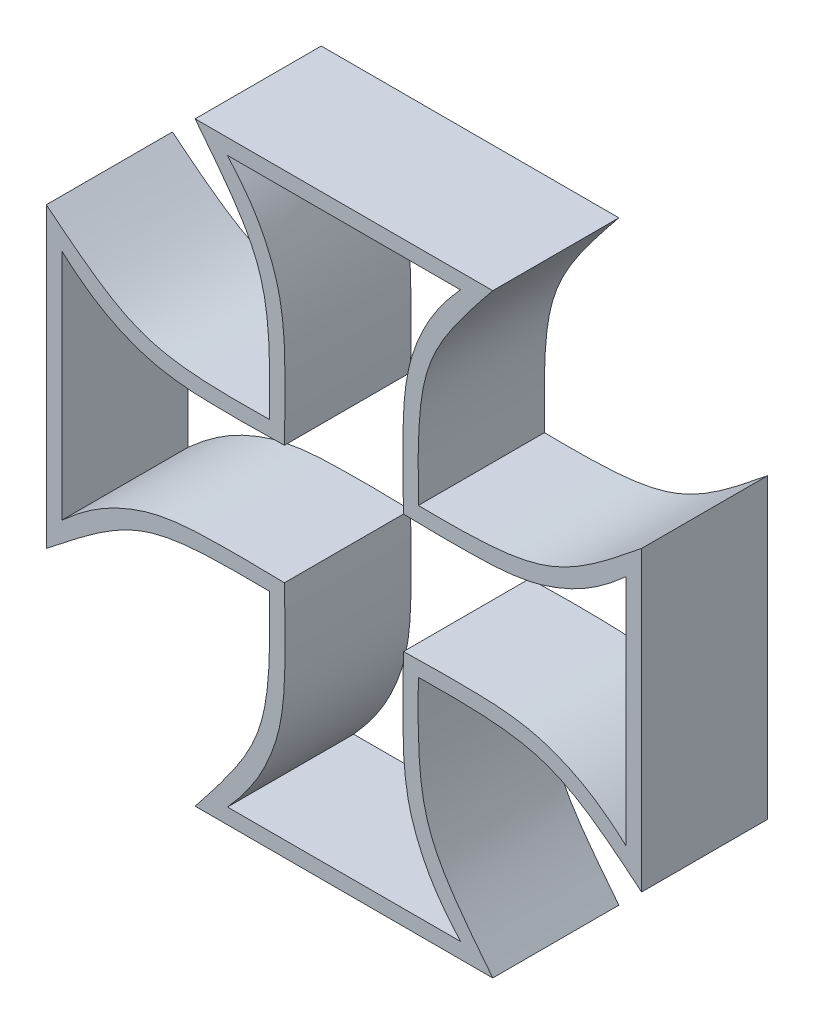
ISO-10303-21;
HEADER;
FILE_DESCRIPTION(('STEP AP214'),'2;1');
FILE_NAME('part.step','',(''),(''),'','','');
FILE_SCHEMA(('AUTOMOTIVE_DESIGN { 1 0 10303 214 1 1 1 1 }'));
ENDSEC;
DATA;
#1=APPLICATION_CONTEXT('core data for automotive mechanical design processes');
#2=APPLICATION_PROTOCOL_DEFINITION('international standard','automotive_design',2000,#1);
#3=PRODUCT_CONTEXT('',#1,'mechanical');
#4=PRODUCT('Part','Part','',(#3));
#5=PRODUCT_RELATED_PRODUCT_CATEGORY('part','',(#4));
#6=PRODUCT_DEFINITION_FORMATION('','',#4);
#7=PRODUCT_DEFINITION_CONTEXT('part definition',#1,'design');
#8=PRODUCT_DEFINITION('design','',#6,#7);
#9=PRODUCT_DEFINITION_SHAPE('','',#8);
#10=(LENGTH_UNIT() NAMED_UNIT(*) SI_UNIT(.MILLI.,.METRE.));
#11=(NAMED_UNIT(*) PLANE_ANGLE_UNIT() SI_UNIT($,.RADIAN.));
#12=(NAMED_UNIT(*) SI_UNIT($,.STERADIAN.) SOLID_ANGLE_UNIT());
#13=UNCERTAINTY_MEASURE_WITH_UNIT(LENGTH_MEASURE(1.E-05),#10,'distance_accuracy_value','');
#14=(GEOMETRIC_REPRESENTATION_CONTEXT(3) GLOBAL_UNCERTAINTY_ASSIGNED_CONTEXT((#13)) GLOBAL_UNIT_ASSIGNED_CONTEXT((#10,
#11,#12)) REPRESENTATION_CONTEXT('',''));
#15=CARTESIAN_POINT('',(0.,0.,0.));
#16=DIRECTION('',(0.,0.,1.));
#17=DIRECTION('',(1.,0.,0.));
#18=AXIS2_PLACEMENT_3D('',#15,#16,#17);
#19=CARTESIAN_POINT('',(15.6903990070244,11.491008785078,10.));
#20=DIRECTION('',(0.,0.,-1.));
#21=DIRECTION('',(-1.,0.,0.));
#22=AXIS2_PLACEMENT_3D('',#19,#20,#21);
#23=PLANE('',#22);
#24=DIRECTION('',(-1.,0.,0.));
#25=VECTOR('',#24,1.);
#26=CARTESIAN_POINT('',(8.99628196755396,19.3477351496124,10.));
#27=LINE('',#26,#25);
#28=CARTESIAN_POINT('',(20.796281967554,19.3477351496124,10.));
#29=VERTEX_POINT('',#28);
#30=CARTESIAN_POINT('',(-2.80371803244616,19.3477351496124,10.));
#31=VERTEX_POINT('',#30);
#32=EDGE_CURVE('E338',#29,#31,#27,.T.);
#33=ORIENTED_EDGE('',*,*,#32,.T.);
#34=CARTESIAN_POINT('',(-2.80371803244616,19.3477351496124,10.));
#35=CARTESIAN_POINT('',(2.70319605919509,12.4005778963878,10.));
#36=CARTESIAN_POINT('',(3.2269660079913,11.2589571382733,10.));
#37=CARTESIAN_POINT('',(3.09628196755396,1.64773514961242,10.));
#38=B_SPLINE_CURVE_WITH_KNOTS('',3,(#34,#35,#36,#37),.UNSPECIFIED.,.F.,.F.,(4,4),(0.,1.),.UNSPECIFIED.);
#39=CARTESIAN_POINT('',(3.09628196755396,1.64773514961242,10.));
#40=VERTEX_POINT('',#39);
#41=EDGE_CURVE('E425',#31,#40,#38,.T.);
#42=ORIENTED_EDGE('',*,*,#41,.T.);
#43=CARTESIAN_POINT('',(3.09628196755396,1.64773514961242,10.));
#44=CARTESIAN_POINT('',(-6.51494002110681,1.51705110917491,10.));
#45=CARTESIAN_POINT('',(-7.77845934755149,2.05771325387504,10.));
#46=CARTESIAN_POINT('',(-14.603718032446,7.54773514961242,10.));
#47=B_SPLINE_CURVE_WITH_KNOTS('',3,(#43,#44,#45,#46),.UNSPECIFIED.,.F.,.F.,(4,4),(0.,1.),.UNSPECIFIED.);
#48=CARTESIAN_POINT('',(-14.603718032446,7.54773514961242,10.));
#49=VERTEX_POINT('',#48);
#50=EDGE_CURVE('E377',#40,#49,#47,.T.);
#51=ORIENTED_EDGE('',*,*,#50,.T.);
#52=DIRECTION('',(0.,-1.,0.));
#53=VECTOR('',#52,1.);
#54=CARTESIAN_POINT('',(-14.603718032446,-4.25226485038758,10.));
#55=LINE('',#54,#53);
#56=CARTESIAN_POINT('',(-14.603718032446,-16.0522648503876,10.));
#57=VERTEX_POINT('',#56);
#58=EDGE_CURVE('E395',#49,#57,#55,.T.);
#59=ORIENTED_EDGE('',*,*,#58,.T.);
#60=CARTESIAN_POINT('',(-14.603718032446,-16.0522648503876,10.));
#61=CARTESIAN_POINT('',(-7.65088527130473,-10.5197428896787,10.));
#62=CARTESIAN_POINT('',(-6.51494002110717,-10.0215808099503,10.));
#63=CARTESIAN_POINT('',(3.09628196755396,-10.1522648503876,10.));
#64=B_SPLINE_CURVE_WITH_KNOTS('',3,(#60,#61,#62,#63),.UNSPECIFIED.,.F.,.F.,(4,4),(0.,1.),.UNSPECIFIED.);
#65=CARTESIAN_POINT('',(3.09628196755396,-10.1522648503876,10.));
#66=VERTEX_POINT('',#65);
#67=EDGE_CURVE('E392',#57,#66,#64,.T.);
#68=ORIENTED_EDGE('',*,*,#67,.T.);
#69=CARTESIAN_POINT('',(3.09628196755396,-10.1522648503876,10.));
#70=CARTESIAN_POINT('',(3.22696600799137,-19.7634868390483,10.));
#71=CARTESIAN_POINT('',(2.70319605919518,-20.905107597163,10.));
#72=CARTESIAN_POINT('',(-2.80371803244604,-27.8522648503876,10.));
#73=B_SPLINE_CURVE_WITH_KNOTS('',3,(#69,#70,#71,#72),.UNSPECIFIED.,.F.,.F.,(4,4),(0.,1.),.UNSPECIFIED.);
#74=CARTESIAN_POINT('',(-2.80371803244604,-27.8522648503876,10.));
#75=VERTEX_POINT('',#74);
#76=EDGE_CURVE('E394',#66,#75,#73,.T.);
#77=ORIENTED_EDGE('',*,*,#76,.T.);
#78=DIRECTION('',(1.,0.,0.));
#79=VECTOR('',#78,1.);
#80=CARTESIAN_POINT('',(-2.80371803244604,-27.8522648503876,10.));
#81=LINE('',#80,#79);
#82=CARTESIAN_POINT('',(20.796281967554,-27.8522648503876,10.));
#83=VERTEX_POINT('',#82);
#84=EDGE_CURVE('E397',#75,#83,#81,.T.);
#85=ORIENTED_EDGE('',*,*,#84,.T.);
#86=CARTESIAN_POINT('',(20.796281967554,-27.8522648503876,10.));
#87=CARTESIAN_POINT('',(15.2893678759127,-20.905107597163,10.));
#88=CARTESIAN_POINT('',(14.7655979271165,-19.7634868390483,10.));
#89=CARTESIAN_POINT('',(14.896281967554,-10.1522648503876,10.));
#90=B_SPLINE_CURVE_WITH_KNOTS('',3,(#86,#87,#88,#89),.UNSPECIFIED.,.F.,.F.,(4,4),(0.,1.),.UNSPECIFIED.);
#91=CARTESIAN_POINT('',(14.896281967554,-10.1522648503876,10.));
#92=VERTEX_POINT('',#91);
#93=EDGE_CURVE('E800',#83,#92,#90,.T.);
#94=ORIENTED_EDGE('',*,*,#93,.T.);
#95=CARTESIAN_POINT('',(14.896281967554,-10.1522648503876,10.));
#96=CARTESIAN_POINT('',(24.5075039562147,-10.0215808099501,10.));
#97=CARTESIAN_POINT('',(26.0757182914177,-10.6367221147252,10.));
#98=CARTESIAN_POINT('',(32.596281967554,-16.0522648503876,10.));
#99=B_SPLINE_CURVE_WITH_KNOTS('',3,(#95,#96,#97,#98),.UNSPECIFIED.,.F.,.F.,(4,4),(0.,1.),.UNSPECIFIED.);
#100=CARTESIAN_POINT('',(32.596281967554,-16.0522648503876,10.));
#101=VERTEX_POINT('',#100);
#102=EDGE_CURVE('E795',#92,#101,#99,.T.);
#103=ORIENTED_EDGE('',*,*,#102,.T.);
#104=DIRECTION('',(0.,1.,0.));
#105=VECTOR('',#104,1.);
#106=CARTESIAN_POINT('',(32.596281967554,-4.25226485038758,10.));
#107=LINE('',#106,#105);
#108=CARTESIAN_POINT('',(32.596281967554,7.54773514961242,10.));
#109=VERTEX_POINT('',#108);
#110=EDGE_CURVE('E792',#101,#109,#107,.T.);
#111=ORIENTED_EDGE('',*,*,#110,.T.);
#112=CARTESIAN_POINT('',(32.596281967554,7.54773514961242,10.));
#113=CARTESIAN_POINT('',(26.0602392239607,2.20446074116856,10.));
#114=CARTESIAN_POINT('',(24.5075039562149,1.51705110917504,10.));
#115=CARTESIAN_POINT('',(14.896281967554,1.64773514961242,10.));
#116=B_SPLINE_CURVE_WITH_KNOTS('',3,(#112,#113,#114,#115),.UNSPECIFIED.,.F.,.F.,(4,4),(0.,1.),.UNSPECIFIED.);
#117=CARTESIAN_POINT('',(14.896281967554,1.64773514961242,10.));
#118=VERTEX_POINT('',#117);
#119=EDGE_CURVE('E266',#109,#118,#116,.T.);
#120=ORIENTED_EDGE('',*,*,#119,.T.);
#121=CARTESIAN_POINT('',(14.896281967554,1.64773514961242,10.));
#122=CARTESIAN_POINT('',(14.7655979271165,11.2589571382732,10.));
#123=CARTESIAN_POINT('',(15.1779447799125,12.3852428555266,10.));
#124=CARTESIAN_POINT('',(20.796281967554,19.3477351496124,10.));
#125=B_SPLINE_CURVE_WITH_KNOTS('',3,(#121,#122,#123,#124),.UNSPECIFIED.,.F.,.F.,(4,4),(0.,1.),.UNSPECIFIED.);
#126=EDGE_CURVE('E260',#118,#29,#125,.T.);
#127=ORIENTED_EDGE('',*,*,#126,.T.);
#128=EDGE_LOOP('',(#33,#42,#51,#59,#68,#77,#85,#94,#103,#111,#120,#127));
#129=FACE_BOUND('',#128,.T.);
#130=CARTESIAN_POINT('',(4.27628196755396,-8.97226485038758,10.));
#131=CARTESIAN_POINT('',(4.35754956470997,-11.8914732948376,10.));
#132=CARTESIAN_POINT('',(4.31289948154372,-14.3793985569048,10.));
#133=CARTESIAN_POINT('',(4.2697068753298,-16.878595862378,10.));
#134=CARTESIAN_POINT('',(3.97079484589589,-19.0935312772129,10.));
#135=CARTESIAN_POINT('',(2.71307852207622,-22.8103115807012,10.));
#136=CARTESIAN_POINT('',(1.4619251129954,-24.7368686184537,10.));
#137=CARTESIAN_POINT('',(-0.235628715823923,-26.6277793566202,10.));
#138=B_SPLINE_CURVE_WITH_KNOTS('',3,(#130,#131,#132,#133,#134,#135,#136,#137),.UNSPECIFIED.,.F.,
.F.,(4,1,1,1,1,4),(0.,0.101134443194349,0.14375527500267,0.39482464662982,0.483587486274893,1.),.UNSPECIFIED.);
#139=CARTESIAN_POINT('',(4.27628196755396,-8.97226485038758,10.));
#140=VERTEX_POINT('',#139);
#141=CARTESIAN_POINT('',(-0.235628715823921,-26.6277793566202,10.));
#142=VERTEX_POINT('',#141);
#143=EDGE_CURVE('E194',#140,#142,#138,.T.);
#144=ORIENTED_EDGE('',*,*,#143,.F.);
#145=CARTESIAN_POINT('',(-13.3598367894793,-13.4869042625118,10.));
#146=CARTESIAN_POINT('',(-11.4689260513128,-11.7893504336925,10.));
#147=CARTESIAN_POINT('',(-9.54411938676072,-10.5379507699494,10.));
#148=CARTESIAN_POINT('',(-5.82459162083569,-9.28062097823289,10.));
#149=CARTESIAN_POINT('',(-3.61928047292149,-8.98035494006546,10.));
#150=CARTESIAN_POINT('',(-1.10755969005649,-8.93892422365594,10.));
#151=CARTESIAN_POINT('',(1.35707352310392,-8.89099725323157,10.));
#152=CARTESIAN_POINT('',(4.27628196755396,-8.97226485038758,10.));
#153=B_SPLINE_CURVE_WITH_KNOTS('',3,(#145,#146,#147,#148,#149,#150,#151,#152),.UNSPECIFIED.,.F.,
.F.,(4,1,1,1,1,4),(0.,0.516412513725107,0.60517535337018,0.85624472499733,0.898865556805651,1.),.UNSPECIFIED.);
#154=CARTESIAN_POINT('',(-13.3598367894793,-13.4869042625118,10.));
#155=VERTEX_POINT('',#154);
#156=EDGE_CURVE('E456',#155,#140,#153,.T.);
#157=ORIENTED_EDGE('',*,*,#156,.F.);
#158=DIRECTION('',(0.000390482254177142,-0.999999923761802,0.));
#159=VECTOR('',#158,1.);
#160=CARTESIAN_POINT('',(-13.3670492910329,4.98384806123709,10.));
#161=LINE('',#160,#159);
#162=CARTESIAN_POINT('',(-13.3670492910329,4.98384806123709,10.));
#163=VERTEX_POINT('',#162);
#164=EDGE_CURVE('E532',#163,#155,#161,.T.);
#165=ORIENTED_EDGE('',*,*,#164,.F.);
#166=CARTESIAN_POINT('',(4.27628196755396,0.467735149612424,10.));
#167=CARTESIAN_POINT('',(1.35707352310392,0.386467552456418,10.));
#168=CARTESIAN_POINT('',(-1.11622106926902,0.436164025160628,10.));
#169=CARTESIAN_POINT('',(-3.62328487295696,0.476643330129926,10.));
#170=CARTESIAN_POINT('',(-5.83217489990305,0.777640526055342,10.));
#171=CARTESIAN_POINT('',(-9.55068099469339,2.03476159242249,10.));
#172=CARTESIAN_POINT('',(-11.4761385528664,3.28629423241776,10.));
#173=CARTESIAN_POINT('',(-13.3670492910329,4.98384806123709,10.));
#174=B_SPLINE_CURVE_WITH_KNOTS('',3,(#166,#167,#168,#169,#170,#171,#172,#173),.UNSPECIFIED.,.F.,
.F.,(4,1,1,1,1,4),(0.,0.101134443194349,0.14375527500267,0.39482464662982,0.483587486274893,1.),.UNSPECIFIED.);
#175=CARTESIAN_POINT('',(4.27628196755396,0.467735149612424,10.));
#176=VERTEX_POINT('',#175);
#177=EDGE_CURVE('E552',#176,#163,#174,.T.);
#178=ORIENTED_EDGE('',*,*,#177,.F.);
#179=CARTESIAN_POINT('',(-0.242713637128268,18.1166764842542,10.));
#180=CARTESIAN_POINT('',(1.45484019169108,16.2257657460877,10.));
#181=CARTESIAN_POINT('',(2.7066329808882,14.299801905498,10.));
#182=CARTESIAN_POINT('',(3.96334570567441,10.5820904937627,10.));
#183=CARTESIAN_POINT('',(4.2657733081879,8.37041671926227,10.));
#184=CARTESIAN_POINT('',(4.30439131143793,5.86697523817289,10.));
#185=CARTESIAN_POINT('',(4.35754956470993,3.38694359406246,10.));
#186=CARTESIAN_POINT('',(4.27628196755396,0.467735149612424,10.));
#187=B_SPLINE_CURVE_WITH_KNOTS('',3,(#179,#180,#181,#182,#183,#184,#185,#186),.UNSPECIFIED.,.F.,
.F.,(4,1,1,1,1,4),(0.,0.516412513725107,0.60517535337018,0.85624472499733,0.898865556805651,1.),.UNSPECIFIED.);
#188=CARTESIAN_POINT('',(-0.242713637128268,18.1166764842542,10.));
#189=VERTEX_POINT('',#188);
#190=EDGE_CURVE('E556',#189,#176,#187,.T.);
#191=ORIENTED_EDGE('',*,*,#190,.F.);
#192=DIRECTION('',(-0.999999923761802,-0.000390482254187473,0.));
#193=VECTOR('',#192,1.);
#194=CARTESIAN_POINT('',(18.2280386866207,18.123888985808,10.));
#195=LINE('',#194,#193);
#196=CARTESIAN_POINT('',(18.2280386866207,18.123888985808,10.));
#197=VERTEX_POINT('',#196);
#198=EDGE_CURVE('E564',#197,#189,#195,.T.);
#199=ORIENTED_EDGE('',*,*,#198,.F.);
#200=CARTESIAN_POINT('',(13.716281967554,0.467735149612424,10.));
#201=CARTESIAN_POINT('',(13.6350143703979,3.38694359406246,10.));
#202=CARTESIAN_POINT('',(13.6794795602545,5.87563661738554,10.));
#203=CARTESIAN_POINT('',(13.7227715783833,8.37442111929779,10.));
#204=CARTESIAN_POINT('',(14.0216072099626,10.5896737728302,10.));
#205=CARTESIAN_POINT('',(15.2793453432601,14.3063635134308,10.));
#206=CARTESIAN_POINT('',(16.5304848578014,16.2329782476415,10.));
#207=CARTESIAN_POINT('',(18.2280386866207,18.123888985808,10.));
#208=B_SPLINE_CURVE_WITH_KNOTS('',3,(#200,#201,#202,#203,#204,#205,#206,#207),.UNSPECIFIED.,.F.,
.F.,(4,1,1,1,1,4),(0.,0.101134443194349,0.14375527500267,0.39482464662982,0.483587486274893,1.),.UNSPECIFIED.);
#209=CARTESIAN_POINT('',(13.716281967554,0.467735149612424,10.));
#210=VERTEX_POINT('',#209);
#211=EDGE_CURVE('E569',#210,#197,#208,.T.);
#212=ORIENTED_EDGE('',*,*,#211,.F.);
#213=CARTESIAN_POINT('',(31.3535784023888,4.98252018345599,10.));
#214=CARTESIAN_POINT('',(29.4626676642223,3.28496635463664,10.));
#215=CARTESIAN_POINT('',(27.5377547199054,2.03355354923283,10.));
#216=CARTESIAN_POINT('',(23.818393775354,0.776244385242487,10.));
#217=CARTESIAN_POINT('',(21.6124982578755,0.475906088855956,10.));
#218=CARTESIAN_POINT('',(19.1015378798379,0.434569397703666,10.));
#219=CARTESIAN_POINT('',(16.635490412004,0.386467552456438,10.));
#220=CARTESIAN_POINT('',(13.716281967554,0.467735149612424,10.));
#221=B_SPLINE_CURVE_WITH_KNOTS('',3,(#213,#214,#215,#216,#217,#218,#219,#220),.UNSPECIFIED.,.F.,
.F.,(4,1,1,1,1,4),(0.,0.516412513725107,0.60517535337018,0.85624472499733,0.898865556805651,1.),.UNSPECIFIED.);
#222=CARTESIAN_POINT('',(31.3535784023888,4.98252018345599,10.));
#223=VERTEX_POINT('',#222);
#224=EDGE_CURVE('E574',#223,#210,#221,.T.);
#225=ORIENTED_EDGE('',*,*,#224,.F.);
#226=DIRECTION('',(-0.000390482254184843,0.999999923761802,0.));
#227=VECTOR('',#226,1.);
#228=CARTESIAN_POINT('',(31.3607909039425,-13.4882321402929,10.));
#229=LINE('',#228,#227);
#230=CARTESIAN_POINT('',(31.3607909039425,-13.4882321402929,10.));
#231=VERTEX_POINT('',#230);
#232=EDGE_CURVE('E605',#231,#223,#229,.T.);
#233=ORIENTED_EDGE('',*,*,#232,.F.);
#234=CARTESIAN_POINT('',(13.716281967554,-8.97226485038758,10.));
#235=CARTESIAN_POINT('',(16.635490412004,-8.89099725323155,10.));
#236=CARTESIAN_POINT('',(19.1101992590505,-8.94051885111291,10.));
#237=CARTESIAN_POINT('',(21.616502657911,-8.98109218133943,10.));
#238=CARTESIAN_POINT('',(23.8259770544214,-9.28201711904575,10.));
#239=CARTESIAN_POINT('',(27.5443163278382,-10.5391588131391,10.));
#240=CARTESIAN_POINT('',(29.469880165776,-11.7906783114736,10.));
#241=CARTESIAN_POINT('',(31.3607909039425,-13.4882321402929,10.));
#242=B_SPLINE_CURVE_WITH_KNOTS('',3,(#234,#235,#236,#237,#238,#239,#240,#241),.UNSPECIFIED.,.F.,
.F.,(4,1,1,1,1,4),(0.,0.101134443194349,0.14375527500267,0.39482464662982,0.483587486274893,1.),.UNSPECIFIED.);
#243=CARTESIAN_POINT('',(13.716281967554,-8.97226485038758,10.));
#244=VERTEX_POINT('',#243);
#245=EDGE_CURVE('E217',#244,#231,#242,.T.);
#246=ORIENTED_EDGE('',*,*,#245,.F.);
#247=CARTESIAN_POINT('',(18.235123607925,-26.6205668550666,10.));
#248=CARTESIAN_POINT('',(16.5375697791057,-24.7296561169,10.));
#249=CARTESIAN_POINT('',(15.2857908844481,-22.8037499727685,10.));
#250=CARTESIAN_POINT('',(14.0290563501841,-19.0859479981455,10.));
#251=CARTESIAN_POINT('',(13.7267051455252,-16.8745914623425,10.));
#252=CARTESIAN_POINT('',(13.6879877303603,-14.3707371776923,10.));
#253=CARTESIAN_POINT('',(13.635014370398,-11.8914732948376,10.));
#254=CARTESIAN_POINT('',(13.716281967554,-8.97226485038758,10.));
#255=B_SPLINE_CURVE_WITH_KNOTS('',3,(#247,#248,#249,#250,#251,#252,#253,#254),.UNSPECIFIED.,.F.,
.F.,(4,1,1,1,1,4),(0.,0.516412513725107,0.60517535337018,0.85624472499733,0.898865556805651,1.),.UNSPECIFIED.);
#256=CARTESIAN_POINT('',(18.235123607925,-26.6205668550666,10.));
#257=VERTEX_POINT('',#256);
#258=EDGE_CURVE('E215',#257,#244,#255,.T.);
#259=ORIENTED_EDGE('',*,*,#258,.F.);
#260=DIRECTION('',(0.999999923761802,0.000390482254180711,0.));
#261=VECTOR('',#260,1.);
#262=CARTESIAN_POINT('',(-0.235628715823921,-26.6277793566202,10.));
#263=LINE('',#262,#261);
#264=EDGE_CURVE('E202',#142,#257,#263,.T.);
#265=ORIENTED_EDGE('',*,*,#264,.F.);
#266=EDGE_LOOP('',(#144,#157,#165,#178,#191,#199,#212,#225,#233,#246,#259,#265));
#267=FACE_BOUND('',#266,.T.);
#268=ADVANCED_FACE('F33',(#129,#267),#23,.F.);
#269=CARTESIAN_POINT('',(15.6903990070244,11.491008785078,0.));
#270=DIRECTION('',(0.,0.,-1.));
#271=DIRECTION('',(-1.,0.,0.));
#272=AXIS2_PLACEMENT_3D('',#269,#270,#271);
#273=PLANE('',#272);
#274=DIRECTION('',(-1.,0.,0.));
#275=VECTOR('',#274,1.);
#276=CARTESIAN_POINT('',(8.99628196755396,19.3477351496124,0.));
#277=LINE('',#276,#275);
#278=CARTESIAN_POINT('',(20.796281967554,19.3477351496124,0.));
#279=VERTEX_POINT('',#278);
#280=CARTESIAN_POINT('',(-2.80371803244616,19.3477351496124,0.));
#281=VERTEX_POINT('',#280);
#282=EDGE_CURVE('E210',#279,#281,#277,.T.);
#283=ORIENTED_EDGE('',*,*,#282,.F.);
#284=CARTESIAN_POINT('',(14.896281967554,1.64773514961242,0.));
#285=CARTESIAN_POINT('',(14.7655979271165,11.2589571382732,0.));
#286=CARTESIAN_POINT('',(15.1779447799125,12.3852428555266,0.));
#287=CARTESIAN_POINT('',(20.796281967554,19.3477351496124,0.));
#288=B_SPLINE_CURVE_WITH_KNOTS('',3,(#284,#285,#286,#287),.UNSPECIFIED.,.F.,.F.,(4,4),(0.,1.),.UNSPECIFIED.);
#289=CARTESIAN_POINT('',(14.896281967554,1.64773514961242,0.));
#290=VERTEX_POINT('',#289);
#291=EDGE_CURVE('E330',#290,#279,#288,.T.);
#292=ORIENTED_EDGE('',*,*,#291,.F.);
#293=CARTESIAN_POINT('',(32.596281967554,7.54773514961242,0.));
#294=CARTESIAN_POINT('',(26.0602392239607,2.20446074116856,0.));
#295=CARTESIAN_POINT('',(24.5075039562149,1.51705110917504,0.));
#296=CARTESIAN_POINT('',(14.896281967554,1.64773514961242,0.));
#297=B_SPLINE_CURVE_WITH_KNOTS('',3,(#293,#294,#295,#296),.UNSPECIFIED.,.F.,.F.,(4,4),(0.,1.),.UNSPECIFIED.);
#298=CARTESIAN_POINT('',(32.596281967554,7.54773514961242,0.));
#299=VERTEX_POINT('',#298);
#300=EDGE_CURVE('E326',#299,#290,#297,.T.);
#301=ORIENTED_EDGE('',*,*,#300,.F.);
#302=DIRECTION('',(0.,1.,0.));
#303=VECTOR('',#302,1.);
#304=CARTESIAN_POINT('',(32.596281967554,-4.25226485038758,0.));
#305=LINE('',#304,#303);
#306=CARTESIAN_POINT('',(32.596281967554,-16.0522648503876,0.));
#307=VERTEX_POINT('',#306);
#308=EDGE_CURVE('E321',#307,#299,#305,.T.);
#309=ORIENTED_EDGE('',*,*,#308,.F.);
#310=CARTESIAN_POINT('',(14.896281967554,-10.1522648503876,0.));
#311=CARTESIAN_POINT('',(24.5075039562147,-10.0215808099501,0.));
#312=CARTESIAN_POINT('',(26.0757182914177,-10.6367221147252,0.));
#313=CARTESIAN_POINT('',(32.596281967554,-16.0522648503876,0.));
#314=B_SPLINE_CURVE_WITH_KNOTS('',3,(#310,#311,#312,#313),.UNSPECIFIED.,.F.,.F.,(4,4),(0.,1.),.UNSPECIFIED.);
#315=CARTESIAN_POINT('',(14.896281967554,-10.1522648503876,0.));
#316=VERTEX_POINT('',#315);
#317=EDGE_CURVE('E313',#316,#307,#314,.T.);
#318=ORIENTED_EDGE('',*,*,#317,.F.);
#319=CARTESIAN_POINT('',(20.796281967554,-27.8522648503876,0.));
#320=CARTESIAN_POINT('',(15.2893678759127,-20.905107597163,0.));
#321=CARTESIAN_POINT('',(14.7655979271165,-19.7634868390483,0.));
#322=CARTESIAN_POINT('',(14.896281967554,-10.1522648503876,0.));
#323=B_SPLINE_CURVE_WITH_KNOTS('',3,(#319,#320,#321,#322),.UNSPECIFIED.,.F.,.F.,(4,4),(0.,1.),.UNSPECIFIED.);
#324=CARTESIAN_POINT('',(20.796281967554,-27.8522648503876,0.));
#325=VERTEX_POINT('',#324);
#326=EDGE_CURVE('E309',#325,#316,#323,.T.);
#327=ORIENTED_EDGE('',*,*,#326,.F.);
#328=DIRECTION('',(1.,0.,0.));
#329=VECTOR('',#328,1.);
#330=CARTESIAN_POINT('',(8.99628196755396,-27.8522648503876,0.));
#331=LINE('',#330,#329);
#332=CARTESIAN_POINT('',(-2.80371803244604,-27.8522648503876,0.));
#333=VERTEX_POINT('',#332);
#334=EDGE_CURVE('E304',#333,#325,#331,.T.);
#335=ORIENTED_EDGE('',*,*,#334,.F.);
#336=CARTESIAN_POINT('',(3.09628196755396,-10.1522648503876,0.));
#337=CARTESIAN_POINT('',(3.22696600799137,-19.7634868390483,0.));
#338=CARTESIAN_POINT('',(2.70319605919518,-20.905107597163,0.));
#339=CARTESIAN_POINT('',(-2.80371803244604,-27.8522648503876,0.));
#340=B_SPLINE_CURVE_WITH_KNOTS('',3,(#336,#337,#338,#339),.UNSPECIFIED.,.F.,.F.,(4,4),(0.,1.),.UNSPECIFIED.);
#341=CARTESIAN_POINT('',(3.09628196755396,-10.1522648503876,0.));
#342=VERTEX_POINT('',#341);
#343=EDGE_CURVE('E296',#342,#333,#340,.T.);
#344=ORIENTED_EDGE('',*,*,#343,.F.);
#345=CARTESIAN_POINT('',(-14.603718032446,-16.0522648503876,0.));
#346=CARTESIAN_POINT('',(-7.65088527130473,-10.5197428896787,0.));
#347=CARTESIAN_POINT('',(-6.51494002110717,-10.0215808099503,0.));
#348=CARTESIAN_POINT('',(3.09628196755396,-10.1522648503876,0.));
#349=B_SPLINE_CURVE_WITH_KNOTS('',3,(#345,#346,#347,#348),.UNSPECIFIED.,.F.,.F.,(4,4),(0.,1.),.UNSPECIFIED.);
#350=CARTESIAN_POINT('',(-14.603718032446,-16.0522648503876,0.));
#351=VERTEX_POINT('',#350);
#352=EDGE_CURVE('E292',#351,#342,#349,.T.);
#353=ORIENTED_EDGE('',*,*,#352,.F.);
#354=DIRECTION('',(0.,-1.,0.));
#355=VECTOR('',#354,1.);
#356=CARTESIAN_POINT('',(-14.603718032446,-4.25226485038758,0.));
#357=LINE('',#356,#355);
#358=CARTESIAN_POINT('',(-14.603718032446,7.54773514961242,0.));
#359=VERTEX_POINT('',#358);
#360=EDGE_CURVE('E287',#359,#351,#357,.T.);
#361=ORIENTED_EDGE('',*,*,#360,.F.);
#362=CARTESIAN_POINT('',(3.09628196755396,1.64773514961242,0.));
#363=CARTESIAN_POINT('',(-6.51494002110681,1.51705110917491,0.));
#364=CARTESIAN_POINT('',(-7.77845934755149,2.05771325387504,0.));
#365=CARTESIAN_POINT('',(-14.603718032446,7.54773514961242,0.));
#366=B_SPLINE_CURVE_WITH_KNOTS('',3,(#362,#363,#364,#365),.UNSPECIFIED.,.F.,.F.,(4,4),(0.,1.),.UNSPECIFIED.);
#367=CARTESIAN_POINT('',(3.09628196755396,1.64773514961242,0.));
#368=VERTEX_POINT('',#367);
#369=EDGE_CURVE('E279',#368,#359,#366,.T.);
#370=ORIENTED_EDGE('',*,*,#369,.F.);
#371=CARTESIAN_POINT('',(-2.80371803244616,19.3477351496124,0.));
#372=CARTESIAN_POINT('',(2.70319605919509,12.4005778963878,0.));
#373=CARTESIAN_POINT('',(3.2269660079913,11.2589571382733,0.));
#374=CARTESIAN_POINT('',(3.09628196755396,1.64773514961242,0.));
#375=B_SPLINE_CURVE_WITH_KNOTS('',3,(#371,#372,#373,#374),.UNSPECIFIED.,.F.,.F.,(4,4),(0.,1.),.UNSPECIFIED.);
#376=EDGE_CURVE('E275',#281,#368,#375,.T.);
#377=ORIENTED_EDGE('',*,*,#376,.F.);
#378=EDGE_LOOP('',(#283,#292,#301,#309,#318,#327,#335,#344,#353,#361,#370,#377));
#379=FACE_BOUND('',#378,.T.);
#380=CARTESIAN_POINT('',(-13.3598367894793,-13.4869042625118,0.));
#381=CARTESIAN_POINT('',(-11.4689260513128,-11.7893504336925,0.));
#382=CARTESIAN_POINT('',(-9.54411938676072,-10.5379507699494,0.));
#383=CARTESIAN_POINT('',(-5.82459162083569,-9.28062097823289,0.));
#384=CARTESIAN_POINT('',(-3.61928047292149,-8.98035494006546,0.));
#385=CARTESIAN_POINT('',(-1.10755969005649,-8.93892422365594,0.));
#386=CARTESIAN_POINT('',(1.35707352310392,-8.89099725323157,0.));
#387=CARTESIAN_POINT('',(4.27628196755396,-8.97226485038758,0.));
#388=B_SPLINE_CURVE_WITH_KNOTS('',3,(#380,#381,#382,#383,#384,#385,#386,#387),.UNSPECIFIED.,.F.,
.F.,(4,1,1,1,1,4),(0.,0.516412513725107,0.60517535337018,0.85624472499733,0.898865556805651,1.),.UNSPECIFIED.);
#389=CARTESIAN_POINT('',(-13.3598367894793,-13.4869042625118,0.));
#390=VERTEX_POINT('',#389);
#391=CARTESIAN_POINT('',(4.27628196755396,-8.97226485038758,0.));
#392=VERTEX_POINT('',#391);
#393=EDGE_CURVE('E203',#390,#392,#388,.T.);
#394=ORIENTED_EDGE('',*,*,#393,.T.);
#395=CARTESIAN_POINT('',(4.27628196755396,-8.97226485038758,0.));
#396=CARTESIAN_POINT('',(4.35754956470997,-11.8914732948376,0.));
#397=CARTESIAN_POINT('',(4.31289948154372,-14.3793985569048,0.));
#398=CARTESIAN_POINT('',(4.2697068753298,-16.878595862378,0.));
#399=CARTESIAN_POINT('',(3.97079484589589,-19.0935312772129,0.));
#400=CARTESIAN_POINT('',(2.71307852207622,-22.8103115807012,0.));
#401=CARTESIAN_POINT('',(1.4619251129954,-24.7368686184537,0.));
#402=CARTESIAN_POINT('',(-0.235628715823923,-26.6277793566202,0.));
#403=B_SPLINE_CURVE_WITH_KNOTS('',3,(#395,#396,#397,#398,#399,#400,#401,#402),.UNSPECIFIED.,.F.,
.F.,(4,1,1,1,1,4),(0.,0.101134443194349,0.14375527500267,0.39482464662982,0.483587486274893,1.),.UNSPECIFIED.);
#404=CARTESIAN_POINT('',(-0.235628715823921,-26.6277793566202,0.));
#405=VERTEX_POINT('',#404);
#406=EDGE_CURVE('E56',#392,#405,#403,.T.);
#407=ORIENTED_EDGE('',*,*,#406,.T.);
#408=DIRECTION('',(0.999999923761802,0.000390482254180711,0.));
#409=VECTOR('',#408,1.);
#410=CARTESIAN_POINT('',(-0.235628715823921,-26.6277793566202,0.));
#411=LINE('',#410,#409);
#412=CARTESIAN_POINT('',(18.235123607925,-26.6205668550666,0.));
#413=VERTEX_POINT('',#412);
#414=EDGE_CURVE('E209',#405,#413,#411,.T.);
#415=ORIENTED_EDGE('',*,*,#414,.T.);
#416=CARTESIAN_POINT('',(18.235123607925,-26.6205668550666,0.));
#417=CARTESIAN_POINT('',(16.5375697791057,-24.7296561169,0.));
#418=CARTESIAN_POINT('',(15.2857908844481,-22.8037499727685,0.));
#419=CARTESIAN_POINT('',(14.0290563501841,-19.0859479981455,0.));
#420=CARTESIAN_POINT('',(13.7267051455252,-16.8745914623425,0.));
#421=CARTESIAN_POINT('',(13.6879877303603,-14.3707371776923,0.));
#422=CARTESIAN_POINT('',(13.635014370398,-11.8914732948376,0.));
#423=CARTESIAN_POINT('',(13.716281967554,-8.97226485038758,0.));
#424=B_SPLINE_CURVE_WITH_KNOTS('',3,(#416,#417,#418,#419,#420,#421,#422,#423),.UNSPECIFIED.,.F.,
.F.,(4,1,1,1,1,4),(0.,0.516412513725107,0.60517535337018,0.85624472499733,0.898865556805651,1.),.UNSPECIFIED.);
#425=CARTESIAN_POINT('',(13.716281967554,-8.97226485038758,0.));
#426=VERTEX_POINT('',#425);
#427=EDGE_CURVE('E510',#413,#426,#424,.T.);
#428=ORIENTED_EDGE('',*,*,#427,.T.);
#429=CARTESIAN_POINT('',(13.716281967554,-8.97226485038758,0.));
#430=CARTESIAN_POINT('',(16.635490412004,-8.89099725323155,0.));
#431=CARTESIAN_POINT('',(19.1101992590505,-8.94051885111291,0.));
#432=CARTESIAN_POINT('',(21.616502657911,-8.98109218133943,0.));
#433=CARTESIAN_POINT('',(23.8259770544214,-9.28201711904575,0.));
#434=CARTESIAN_POINT('',(27.5443163278382,-10.5391588131391,0.));
#435=CARTESIAN_POINT('',(29.469880165776,-11.7906783114736,0.));
#436=CARTESIAN_POINT('',(31.3607909039425,-13.4882321402929,0.));
#437=B_SPLINE_CURVE_WITH_KNOTS('',3,(#429,#430,#431,#432,#433,#434,#435,#436),.UNSPECIFIED.,.F.,
.F.,(4,1,1,1,1,4),(0.,0.101134443194349,0.14375527500267,0.39482464662982,0.483587486274893,1.),.UNSPECIFIED.);
#438=CARTESIAN_POINT('',(31.3607909039425,-13.4882321402929,0.));
#439=VERTEX_POINT('',#438);
#440=EDGE_CURVE('E505',#426,#439,#437,.T.);
#441=ORIENTED_EDGE('',*,*,#440,.T.);
#442=DIRECTION('',(-0.000390482254184843,0.999999923761802,0.));
#443=VECTOR('',#442,1.);
#444=CARTESIAN_POINT('',(31.3607909039425,-13.4882321402929,0.));
#445=LINE('',#444,#443);
#446=CARTESIAN_POINT('',(31.3535784023888,4.98252018345599,0.));
#447=VERTEX_POINT('',#446);
#448=EDGE_CURVE('E499',#439,#447,#445,.T.);
#449=ORIENTED_EDGE('',*,*,#448,.T.);
#450=CARTESIAN_POINT('',(31.3535784023888,4.98252018345599,0.));
#451=CARTESIAN_POINT('',(29.4626676642223,3.28496635463664,0.));
#452=CARTESIAN_POINT('',(27.5377547199054,2.03355354923283,0.));
#453=CARTESIAN_POINT('',(23.818393775354,0.776244385242487,0.));
#454=CARTESIAN_POINT('',(21.6124982578755,0.475906088855956,0.));
#455=CARTESIAN_POINT('',(19.1015378798379,0.434569397703666,0.));
#456=CARTESIAN_POINT('',(16.635490412004,0.386467552456438,0.));
#457=CARTESIAN_POINT('',(13.716281967554,0.467735149612424,0.));
#458=B_SPLINE_CURVE_WITH_KNOTS('',3,(#450,#451,#452,#453,#454,#455,#456,#457),.UNSPECIFIED.,.F.,
.F.,(4,1,1,1,1,4),(0.,0.516412513725107,0.60517535337018,0.85624472499733,0.898865556805651,1.),.UNSPECIFIED.);
#459=CARTESIAN_POINT('',(13.716281967554,0.467735149612424,0.));
#460=VERTEX_POINT('',#459);
#461=EDGE_CURVE('E491',#447,#460,#458,.T.);
#462=ORIENTED_EDGE('',*,*,#461,.T.);
#463=CARTESIAN_POINT('',(13.716281967554,0.467735149612424,0.));
#464=CARTESIAN_POINT('',(13.6350143703979,3.38694359406246,0.));
#465=CARTESIAN_POINT('',(13.6794795602545,5.87563661738554,0.));
#466=CARTESIAN_POINT('',(13.7227715783833,8.37442111929779,0.));
#467=CARTESIAN_POINT('',(14.0216072099626,10.5896737728302,0.));
#468=CARTESIAN_POINT('',(15.2793453432601,14.3063635134308,0.));
#469=CARTESIAN_POINT('',(16.5304848578014,16.2329782476415,0.));
#470=CARTESIAN_POINT('',(18.2280386866207,18.123888985808,0.));
#471=B_SPLINE_CURVE_WITH_KNOTS('',3,(#463,#464,#465,#466,#467,#468,#469,#470),.UNSPECIFIED.,.F.,
.F.,(4,1,1,1,1,4),(0.,0.101134443194349,0.14375527500267,0.39482464662982,0.483587486274893,1.),.UNSPECIFIED.);
#472=CARTESIAN_POINT('',(18.2280386866207,18.123888985808,0.));
#473=VERTEX_POINT('',#472);
#474=EDGE_CURVE('E486',#460,#473,#471,.T.);
#475=ORIENTED_EDGE('',*,*,#474,.T.);
#476=DIRECTION('',(-0.999999923761802,-0.000390482254187473,0.));
#477=VECTOR('',#476,1.);
#478=CARTESIAN_POINT('',(18.2280386866207,18.123888985808,0.));
#479=LINE('',#478,#477);
#480=CARTESIAN_POINT('',(-0.242713637128268,18.1166764842542,0.));
#481=VERTEX_POINT('',#480);
#482=EDGE_CURVE('E480',#473,#481,#479,.T.);
#483=ORIENTED_EDGE('',*,*,#482,.T.);
#484=CARTESIAN_POINT('',(-0.242713637128268,18.1166764842542,0.));
#485=CARTESIAN_POINT('',(1.45484019169108,16.2257657460877,0.));
#486=CARTESIAN_POINT('',(2.7066329808882,14.299801905498,0.));
#487=CARTESIAN_POINT('',(3.96334570567441,10.5820904937627,0.));
#488=CARTESIAN_POINT('',(4.2657733081879,8.37041671926227,0.));
#489=CARTESIAN_POINT('',(4.30439131143793,5.86697523817289,0.));
#490=CARTESIAN_POINT('',(4.35754956470993,3.38694359406246,0.));
#491=CARTESIAN_POINT('',(4.27628196755396,0.467735149612424,0.));
#492=B_SPLINE_CURVE_WITH_KNOTS('',3,(#484,#485,#486,#487,#488,#489,#490,#491),.UNSPECIFIED.,.F.,
.F.,(4,1,1,1,1,4),(0.,0.516412513725107,0.60517535337018,0.85624472499733,0.898865556805651,1.),.UNSPECIFIED.);
#493=CARTESIAN_POINT('',(4.27628196755396,0.467735149612424,0.));
#494=VERTEX_POINT('',#493);
#495=EDGE_CURVE('E472',#481,#494,#492,.T.);
#496=ORIENTED_EDGE('',*,*,#495,.T.);
#497=CARTESIAN_POINT('',(4.27628196755396,0.467735149612424,0.));
#498=CARTESIAN_POINT('',(1.35707352310392,0.386467552456418,0.));
#499=CARTESIAN_POINT('',(-1.11622106926902,0.436164025160628,0.));
#500=CARTESIAN_POINT('',(-3.62328487295696,0.476643330129926,0.));
#501=CARTESIAN_POINT('',(-5.83217489990305,0.777640526055342,0.));
#502=CARTESIAN_POINT('',(-9.55068099469339,2.03476159242249,0.));
#503=CARTESIAN_POINT('',(-11.4761385528664,3.28629423241776,0.));
#504=CARTESIAN_POINT('',(-13.3670492910329,4.98384806123709,0.));
#505=B_SPLINE_CURVE_WITH_KNOTS('',3,(#497,#498,#499,#500,#501,#502,#503,#504),.UNSPECIFIED.,.F.,
.F.,(4,1,1,1,1,4),(0.,0.101134443194349,0.14375527500267,0.39482464662982,0.483587486274893,1.),.UNSPECIFIED.);
#506=CARTESIAN_POINT('',(-13.3670492910329,4.98384806123709,0.));
#507=VERTEX_POINT('',#506);
#508=EDGE_CURVE('E467',#494,#507,#505,.T.);
#509=ORIENTED_EDGE('',*,*,#508,.T.);
#510=DIRECTION('',(0.000390482254177142,-0.999999923761802,0.));
#511=VECTOR('',#510,1.);
#512=CARTESIAN_POINT('',(-13.3670492910329,4.98384806123709,0.));
#513=LINE('',#512,#511);
#514=EDGE_CURVE('E461',#507,#390,#513,.T.);
#515=ORIENTED_EDGE('',*,*,#514,.T.);
#516=EDGE_LOOP('',(#394,#407,#415,#428,#441,#449,#462,#475,#483,#496,#509,#515));
#517=FACE_BOUND('',#516,.T.);
#518=ADVANCED_FACE('F248',(#379,#517),#273,.T.);
#519=CARTESIAN_POINT('',(8.99628196755396,19.3477351496124,10.));
#520=DIRECTION('',(0.,-1.,0.));
#521=DIRECTION('',(1.,0.,0.));
#522=AXIS2_PLACEMENT_3D('',#519,#520,#521);
#523=PLANE('',#522);
#524=ORIENTED_EDGE('',*,*,#282,.T.);
#525=DIRECTION('',(0.,0.,-1.));
#526=VECTOR('',#525,1.);
#527=CARTESIAN_POINT('',(-2.80371803244616,19.3477351496124,10.));
#528=LINE('',#527,#526);
#529=EDGE_CURVE('E11',#31,#281,#528,.T.);
#530=ORIENTED_EDGE('',*,*,#529,.F.);
#531=ORIENTED_EDGE('',*,*,#32,.F.);
#532=DIRECTION('',(0.,0.,-1.));
#533=VECTOR('',#532,1.);
#534=CARTESIAN_POINT('',(20.796281967554,19.3477351496124,10.));
#535=LINE('',#534,#533);
#536=EDGE_CURVE('E265',#29,#279,#535,.T.);
#537=ORIENTED_EDGE('',*,*,#536,.T.);
#538=EDGE_LOOP('',(#524,#530,#531,#537));
#539=FACE_BOUND('',#538,.T.);
#540=ADVANCED_FACE('F35',(#539),#523,.F.);
#541=DIRECTION('',(0.,0.,-1.));
#542=VECTOR('',#541,1.);
#543=SURFACE_OF_LINEAR_EXTRUSION('',#38,#542);
#544=ORIENTED_EDGE('',*,*,#376,.T.);
#545=DIRECTION('',(0.,0.,-1.));
#546=VECTOR('',#545,1.);
#547=CARTESIAN_POINT('',(3.09628196755396,1.64773514961242,10.));
#548=LINE('',#547,#546);
#549=EDGE_CURVE('E41',#40,#368,#548,.T.);
#550=ORIENTED_EDGE('',*,*,#549,.F.);
#551=ORIENTED_EDGE('',*,*,#41,.F.);
#552=ORIENTED_EDGE('',*,*,#529,.T.);
#553=EDGE_LOOP('',(#544,#550,#551,#552));
#554=FACE_BOUND('',#553,.T.);
#555=ADVANCED_FACE('F420',(#554),#543,.F.);
#556=DIRECTION('',(0.,0.,-1.));
#557=VECTOR('',#556,1.);
#558=SURFACE_OF_LINEAR_EXTRUSION('',#47,#557);
#559=ORIENTED_EDGE('',*,*,#369,.T.);
#560=DIRECTION('',(0.,0.,-1.));
#561=VECTOR('',#560,1.);
#562=CARTESIAN_POINT('',(-14.603718032446,7.54773514961242,10.));
#563=LINE('',#562,#561);
#564=EDGE_CURVE('E368',#49,#359,#563,.T.);
#565=ORIENTED_EDGE('',*,*,#564,.F.);
#566=ORIENTED_EDGE('',*,*,#50,.F.);
#567=ORIENTED_EDGE('',*,*,#549,.T.);
#568=EDGE_LOOP('',(#559,#565,#566,#567));
#569=FACE_BOUND('',#568,.T.);
#570=ADVANCED_FACE('F375',(#569),#558,.F.);
#571=CARTESIAN_POINT('',(-14.603718032446,-4.25226485038758,10.));
#572=DIRECTION('',(1.,0.,0.));
#573=DIRECTION('',(0.,0.,-1.));
#574=AXIS2_PLACEMENT_3D('',#571,#572,#573);
#575=PLANE('',#574);
#576=ORIENTED_EDGE('',*,*,#360,.T.);
#577=DIRECTION('',(0.,0.,-1.));
#578=VECTOR('',#577,1.);
#579=CARTESIAN_POINT('',(-14.603718032446,-16.0522648503876,10.));
#580=LINE('',#579,#578);
#581=EDGE_CURVE('E365',#57,#351,#580,.T.);
#582=ORIENTED_EDGE('',*,*,#581,.F.);
#583=ORIENTED_EDGE('',*,*,#58,.F.);
#584=ORIENTED_EDGE('',*,*,#564,.T.);
#585=EDGE_LOOP('',(#576,#582,#583,#584));
#586=FACE_BOUND('',#585,.T.);
#587=ADVANCED_FACE('F386',(#586),#575,.F.);
#588=DIRECTION('',(0.,0.,-1.));
#589=VECTOR('',#588,1.);
#590=SURFACE_OF_LINEAR_EXTRUSION('',#64,#589);
#591=ORIENTED_EDGE('',*,*,#352,.T.);
#592=DIRECTION('',(0.,0.,-1.));
#593=VECTOR('',#592,1.);
#594=CARTESIAN_POINT('',(3.09628196755396,-10.1522648503876,10.));
#595=LINE('',#594,#593);
#596=EDGE_CURVE('E362',#66,#342,#595,.T.);
#597=ORIENTED_EDGE('',*,*,#596,.F.);
#598=ORIENTED_EDGE('',*,*,#67,.F.);
#599=ORIENTED_EDGE('',*,*,#581,.T.);
#600=EDGE_LOOP('',(#591,#597,#598,#599));
#601=FACE_BOUND('',#600,.T.);
#602=ADVANCED_FACE('F390',(#601),#590,.F.);
#603=DIRECTION('',(0.,0.,-1.));
#604=VECTOR('',#603,1.);
#605=SURFACE_OF_LINEAR_EXTRUSION('',#73,#604);
#606=ORIENTED_EDGE('',*,*,#343,.T.);
#607=DIRECTION('',(0.,0.,-1.));
#608=VECTOR('',#607,1.);
#609=CARTESIAN_POINT('',(-2.80371803244604,-27.8522648503876,10.));
#610=LINE('',#609,#608);
#611=EDGE_CURVE('E359',#75,#333,#610,.T.);
#612=ORIENTED_EDGE('',*,*,#611,.F.);
#613=ORIENTED_EDGE('',*,*,#76,.F.);
#614=ORIENTED_EDGE('',*,*,#596,.T.);
#615=EDGE_LOOP('',(#606,#612,#613,#614));
#616=FACE_BOUND('',#615,.T.);
#617=ADVANCED_FACE('F415',(#616),#605,.F.);
#618=CARTESIAN_POINT('',(8.99628196755396,-27.8522648503876,10.));
#619=DIRECTION('',(0.,1.,0.));
#620=DIRECTION('',(0.,0.,1.));
#621=AXIS2_PLACEMENT_3D('',#618,#619,#620);
#622=PLANE('',#621);
#623=ORIENTED_EDGE('',*,*,#334,.T.);
#624=DIRECTION('',(0.,0.,-1.));
#625=VECTOR('',#624,1.);
#626=CARTESIAN_POINT('',(20.796281967554,-27.8522648503876,10.));
#627=LINE('',#626,#625);
#628=EDGE_CURVE('E356',#83,#325,#627,.T.);
#629=ORIENTED_EDGE('',*,*,#628,.F.);
#630=ORIENTED_EDGE('',*,*,#84,.F.);
#631=ORIENTED_EDGE('',*,*,#611,.T.);
#632=EDGE_LOOP('',(#623,#629,#630,#631));
#633=FACE_BOUND('',#632,.T.);
#634=ADVANCED_FACE('F710',(#633),#622,.F.);
#635=DIRECTION('',(0.,0.,-1.));
#636=VECTOR('',#635,1.);
#637=SURFACE_OF_LINEAR_EXTRUSION('',#90,#636);
#638=ORIENTED_EDGE('',*,*,#326,.T.);
#639=DIRECTION('',(0.,0.,-1.));
#640=VECTOR('',#639,1.);
#641=CARTESIAN_POINT('',(14.896281967554,-10.1522648503876,10.));
#642=LINE('',#641,#640);
#643=EDGE_CURVE('E353',#92,#316,#642,.T.);
#644=ORIENTED_EDGE('',*,*,#643,.F.);
#645=ORIENTED_EDGE('',*,*,#93,.F.);
#646=ORIENTED_EDGE('',*,*,#628,.T.);
#647=EDGE_LOOP('',(#638,#644,#645,#646));
#648=FACE_BOUND('',#647,.T.);
#649=ADVANCED_FACE('F700',(#648),#637,.F.);
#650=DIRECTION('',(0.,0.,-1.));
#651=VECTOR('',#650,1.);
#652=SURFACE_OF_LINEAR_EXTRUSION('',#99,#651);
#653=ORIENTED_EDGE('',*,*,#317,.T.);
#654=DIRECTION('',(0.,0.,-1.));
#655=VECTOR('',#654,1.);
#656=CARTESIAN_POINT('',(32.596281967554,-16.0522648503876,10.));
#657=LINE('',#656,#655);
#658=EDGE_CURVE('E350',#101,#307,#657,.T.);
#659=ORIENTED_EDGE('',*,*,#658,.F.);
#660=ORIENTED_EDGE('',*,*,#102,.F.);
#661=ORIENTED_EDGE('',*,*,#643,.T.);
#662=EDGE_LOOP('',(#653,#659,#660,#661));
#663=FACE_BOUND('',#662,.T.);
#664=ADVANCED_FACE('F690',(#663),#652,.F.);
#665=CARTESIAN_POINT('',(32.596281967554,-4.25226485038758,10.));
#666=DIRECTION('',(-1.,0.,0.));
#667=DIRECTION('',(0.,0.,1.));
#668=AXIS2_PLACEMENT_3D('',#665,#666,#667);
#669=PLANE('',#668);
#670=ORIENTED_EDGE('',*,*,#308,.T.);
#671=DIRECTION('',(0.,0.,-1.));
#672=VECTOR('',#671,1.);
#673=CARTESIAN_POINT('',(32.596281967554,7.54773514961242,10.));
#674=LINE('',#673,#672);
#675=EDGE_CURVE('E347',#109,#299,#674,.T.);
#676=ORIENTED_EDGE('',*,*,#675,.F.);
#677=ORIENTED_EDGE('',*,*,#110,.F.);
#678=ORIENTED_EDGE('',*,*,#658,.T.);
#679=EDGE_LOOP('',(#670,#676,#677,#678));
#680=FACE_BOUND('',#679,.T.);
#681=ADVANCED_FACE('F681',(#680),#669,.F.);
#682=DIRECTION('',(0.,0.,-1.));
#683=VECTOR('',#682,1.);
#684=SURFACE_OF_LINEAR_EXTRUSION('',#116,#683);
#685=ORIENTED_EDGE('',*,*,#300,.T.);
#686=DIRECTION('',(0.,0.,-1.));
#687=VECTOR('',#686,1.);
#688=CARTESIAN_POINT('',(14.896281967554,1.64773514961242,10.));
#689=LINE('',#688,#687);
#690=EDGE_CURVE('E344',#118,#290,#689,.T.);
#691=ORIENTED_EDGE('',*,*,#690,.F.);
#692=ORIENTED_EDGE('',*,*,#119,.F.);
#693=ORIENTED_EDGE('',*,*,#675,.T.);
#694=EDGE_LOOP('',(#685,#691,#692,#693));
#695=FACE_BOUND('',#694,.T.);
#696=ADVANCED_FACE('F256',(#695),#684,.F.);
#697=DIRECTION('',(0.,0.,-1.));
#698=VECTOR('',#697,1.);
#699=SURFACE_OF_LINEAR_EXTRUSION('',#125,#698);
#700=ORIENTED_EDGE('',*,*,#291,.T.);
#701=ORIENTED_EDGE('',*,*,#536,.F.);
#702=ORIENTED_EDGE('',*,*,#126,.F.);
#703=ORIENTED_EDGE('',*,*,#690,.T.);
#704=EDGE_LOOP('',(#700,#701,#702,#703));
#705=FACE_BOUND('',#704,.T.);
#706=ADVANCED_FACE('F245',(#705),#699,.F.);
#707=DIRECTION('',(0.,0.,-1.));
#708=VECTOR('',#707,1.);
#709=SURFACE_OF_LINEAR_EXTRUSION('',#138,#708);
#710=ORIENTED_EDGE('',*,*,#406,.F.);
#711=DIRECTION('',(0.,0.,-1.));
#712=VECTOR('',#711,1.);
#713=CARTESIAN_POINT('',(4.27628196755396,-8.97226485038758,10.));
#714=LINE('',#713,#712);
#715=EDGE_CURVE('E198',#140,#392,#714,.T.);
#716=ORIENTED_EDGE('',*,*,#715,.F.);
#717=ORIENTED_EDGE('',*,*,#143,.T.);
#718=DIRECTION('',(0.,0.,-1.));
#719=VECTOR('',#718,1.);
#720=CARTESIAN_POINT('',(-0.235628715823921,-26.6277793566202,10.));
#721=LINE('',#720,#719);
#722=EDGE_CURVE('E197',#142,#405,#721,.T.);
#723=ORIENTED_EDGE('',*,*,#722,.T.);
#724=EDGE_LOOP('',(#710,#716,#717,#723));
#725=FACE_BOUND('',#724,.T.);
#726=ADVANCED_FACE('F196',(#725),#709,.T.);
#727=CARTESIAN_POINT('',(-0.235628715823921,-26.6277793566202,10.));
#728=DIRECTION('',(-0.000390482254180711,0.999999923761802,0.));
#729=DIRECTION('',(-0.999999923761802,-0.000390482254180711,0.));
#730=AXIS2_PLACEMENT_3D('',#727,#728,#729);
#731=PLANE('',#730);
#732=ORIENTED_EDGE('',*,*,#414,.F.);
#733=ORIENTED_EDGE('',*,*,#722,.F.);
#734=ORIENTED_EDGE('',*,*,#264,.T.);
#735=DIRECTION('',(0.,0.,-1.));
#736=VECTOR('',#735,1.);
#737=CARTESIAN_POINT('',(18.235123607925,-26.6205668550666,10.));
#738=LINE('',#737,#736);
#739=EDGE_CURVE('E211',#257,#413,#738,.T.);
#740=ORIENTED_EDGE('',*,*,#739,.T.);
#741=EDGE_LOOP('',(#732,#733,#734,#740));
#742=FACE_BOUND('',#741,.T.);
#743=ADVANCED_FACE('F206',(#742),#731,.T.);
#744=DIRECTION('',(0.,0.,-1.));
#745=VECTOR('',#744,1.);
#746=SURFACE_OF_LINEAR_EXTRUSION('',#255,#745);
#747=ORIENTED_EDGE('',*,*,#427,.F.);
#748=ORIENTED_EDGE('',*,*,#739,.F.);
#749=ORIENTED_EDGE('',*,*,#258,.T.);
#750=DIRECTION('',(0.,0.,-1.));
#751=VECTOR('',#750,1.);
#752=CARTESIAN_POINT('',(13.716281967554,-8.97226485038758,10.));
#753=LINE('',#752,#751);
#754=EDGE_CURVE('E438',#244,#426,#753,.T.);
#755=ORIENTED_EDGE('',*,*,#754,.T.);
#756=EDGE_LOOP('',(#747,#748,#749,#755));
#757=FACE_BOUND('',#756,.T.);
#758=ADVANCED_FACE('F234',(#757),#746,.T.);
#759=DIRECTION('',(0.,0.,-1.));
#760=VECTOR('',#759,1.);
#761=SURFACE_OF_LINEAR_EXTRUSION('',#242,#760);
#762=ORIENTED_EDGE('',*,*,#440,.F.);
#763=ORIENTED_EDGE('',*,*,#754,.F.);
#764=ORIENTED_EDGE('',*,*,#245,.T.);
#765=DIRECTION('',(0.,0.,-1.));
#766=VECTOR('',#765,1.);
#767=CARTESIAN_POINT('',(31.3607909039425,-13.4882321402929,10.));
#768=LINE('',#767,#766);
#769=EDGE_CURVE('E440',#231,#439,#768,.T.);
#770=ORIENTED_EDGE('',*,*,#769,.T.);
#771=EDGE_LOOP('',(#762,#763,#764,#770));
#772=FACE_BOUND('',#771,.T.);
#773=ADVANCED_FACE('F238',(#772),#761,.T.);
#774=CARTESIAN_POINT('',(31.3607909039425,-13.4882321402929,10.));
#775=DIRECTION('',(-0.999999923761802,-0.000390482254184843,0.));
#776=DIRECTION('',(0.000390482254184844,-0.999999923761802,0.));
#777=AXIS2_PLACEMENT_3D('',#774,#775,#776);
#778=PLANE('',#777);
#779=ORIENTED_EDGE('',*,*,#448,.F.);
#780=ORIENTED_EDGE('',*,*,#769,.F.);
#781=ORIENTED_EDGE('',*,*,#232,.T.);
#782=DIRECTION('',(0.,0.,-1.));
#783=VECTOR('',#782,1.);
#784=CARTESIAN_POINT('',(31.3535784023888,4.98252018345599,10.));
#785=LINE('',#784,#783);
#786=EDGE_CURVE('E442',#223,#447,#785,.T.);
#787=ORIENTED_EDGE('',*,*,#786,.T.);
#788=EDGE_LOOP('',(#779,#780,#781,#787));
#789=FACE_BOUND('',#788,.T.);
#790=ADVANCED_FACE('F589',(#789),#778,.T.);
#791=DIRECTION('',(0.,0.,-1.));
#792=VECTOR('',#791,1.);
#793=SURFACE_OF_LINEAR_EXTRUSION('',#221,#792);
#794=ORIENTED_EDGE('',*,*,#461,.F.);
#795=ORIENTED_EDGE('',*,*,#786,.F.);
#796=ORIENTED_EDGE('',*,*,#224,.T.);
#797=DIRECTION('',(0.,0.,-1.));
#798=VECTOR('',#797,1.);
#799=CARTESIAN_POINT('',(13.716281967554,0.467735149612424,10.));
#800=LINE('',#799,#798);
#801=EDGE_CURVE('E444',#210,#460,#800,.T.);
#802=ORIENTED_EDGE('',*,*,#801,.T.);
#803=EDGE_LOOP('',(#794,#795,#796,#802));
#804=FACE_BOUND('',#803,.T.);
#805=ADVANCED_FACE('F586',(#804),#793,.T.);
#806=DIRECTION('',(0.,0.,-1.));
#807=VECTOR('',#806,1.);
#808=SURFACE_OF_LINEAR_EXTRUSION('',#208,#807);
#809=ORIENTED_EDGE('',*,*,#474,.F.);
#810=ORIENTED_EDGE('',*,*,#801,.F.);
#811=ORIENTED_EDGE('',*,*,#211,.T.);
#812=DIRECTION('',(0.,0.,-1.));
#813=VECTOR('',#812,1.);
#814=CARTESIAN_POINT('',(18.2280386866207,18.123888985808,10.));
#815=LINE('',#814,#813);
#816=EDGE_CURVE('E446',#197,#473,#815,.T.);
#817=ORIENTED_EDGE('',*,*,#816,.T.);
#818=EDGE_LOOP('',(#809,#810,#811,#817));
#819=FACE_BOUND('',#818,.T.);
#820=ADVANCED_FACE('F582',(#819),#808,.T.);
#821=CARTESIAN_POINT('',(18.2280386866207,18.123888985808,10.));
#822=DIRECTION('',(0.000390482254187473,-0.999999923761802,0.));
#823=DIRECTION('',(0.999999923761802,0.000390482254187473,0.));
#824=AXIS2_PLACEMENT_3D('',#821,#822,#823);
#825=PLANE('',#824);
#826=ORIENTED_EDGE('',*,*,#482,.F.);
#827=ORIENTED_EDGE('',*,*,#816,.F.);
#828=ORIENTED_EDGE('',*,*,#198,.T.);
#829=DIRECTION('',(0.,0.,-1.));
#830=VECTOR('',#829,1.);
#831=CARTESIAN_POINT('',(-0.242713637128268,18.1166764842542,10.));
#832=LINE('',#831,#830);
#833=EDGE_CURVE('E448',#189,#481,#832,.T.);
#834=ORIENTED_EDGE('',*,*,#833,.T.);
#835=EDGE_LOOP('',(#826,#827,#828,#834));
#836=FACE_BOUND('',#835,.T.);
#837=ADVANCED_FACE('F585',(#836),#825,.T.);
#838=DIRECTION('',(0.,0.,-1.));
#839=VECTOR('',#838,1.);
#840=SURFACE_OF_LINEAR_EXTRUSION('',#187,#839);
#841=ORIENTED_EDGE('',*,*,#495,.F.);
#842=ORIENTED_EDGE('',*,*,#833,.F.);
#843=ORIENTED_EDGE('',*,*,#190,.T.);
#844=DIRECTION('',(0.,0.,-1.));
#845=VECTOR('',#844,1.);
#846=CARTESIAN_POINT('',(4.27628196755396,0.467735149612424,10.));
#847=LINE('',#846,#845);
#848=EDGE_CURVE('E450',#176,#494,#847,.T.);
#849=ORIENTED_EDGE('',*,*,#848,.T.);
#850=EDGE_LOOP('',(#841,#842,#843,#849));
#851=FACE_BOUND('',#850,.T.);
#852=ADVANCED_FACE('F548',(#851),#840,.T.);
#853=DIRECTION('',(0.,0.,-1.));
#854=VECTOR('',#853,1.);
#855=SURFACE_OF_LINEAR_EXTRUSION('',#174,#854);
#856=ORIENTED_EDGE('',*,*,#508,.F.);
#857=ORIENTED_EDGE('',*,*,#848,.F.);
#858=ORIENTED_EDGE('',*,*,#177,.T.);
#859=DIRECTION('',(0.,0.,-1.));
#860=VECTOR('',#859,1.);
#861=CARTESIAN_POINT('',(-13.3670492910329,4.98384806123709,10.));
#862=LINE('',#861,#860);
#863=EDGE_CURVE('E452',#163,#507,#862,.T.);
#864=ORIENTED_EDGE('',*,*,#863,.T.);
#865=EDGE_LOOP('',(#856,#857,#858,#864));
#866=FACE_BOUND('',#865,.T.);
#867=ADVANCED_FACE('F544',(#866),#855,.T.);
#868=CARTESIAN_POINT('',(-13.3670492910329,4.98384806123709,10.));
#869=DIRECTION('',(0.999999923761802,0.000390482254177142,0.));
#870=DIRECTION('',(-0.000390482254177142,0.999999923761802,0.));
#871=AXIS2_PLACEMENT_3D('',#868,#869,#870);
#872=PLANE('',#871);
#873=ORIENTED_EDGE('',*,*,#514,.F.);
#874=ORIENTED_EDGE('',*,*,#863,.F.);
#875=ORIENTED_EDGE('',*,*,#164,.T.);
#876=DIRECTION('',(0.,0.,-1.));
#877=VECTOR('',#876,1.);
#878=CARTESIAN_POINT('',(-13.3598367894793,-13.4869042625118,10.));
#879=LINE('',#878,#877);
#880=EDGE_CURVE('E48',#155,#390,#879,.T.);
#881=ORIENTED_EDGE('',*,*,#880,.T.);
#882=EDGE_LOOP('',(#873,#874,#875,#881));
#883=FACE_BOUND('',#882,.T.);
#884=ADVANCED_FACE('F541',(#883),#872,.T.);
#885=DIRECTION('',(0.,0.,-1.));
#886=VECTOR('',#885,1.);
#887=SURFACE_OF_LINEAR_EXTRUSION('',#153,#886);
#888=ORIENTED_EDGE('',*,*,#393,.F.);
#889=ORIENTED_EDGE('',*,*,#880,.F.);
#890=ORIENTED_EDGE('',*,*,#156,.T.);
#891=ORIENTED_EDGE('',*,*,#715,.T.);
#892=EDGE_LOOP('',(#888,#889,#890,#891));
#893=FACE_BOUND('',#892,.T.);
#894=ADVANCED_FACE('F538',(#893),#887,.T.);
#895=CLOSED_SHELL('',(#268,#518,#540,#555,#570,#587,#602,#617,#634,#649,#664,#681,#696,#706,
#726,#743,#758,#773,#790,#805,#820,#837,#852,#867,#884,#894));
#896=MANIFOLD_SOLID_BREP('B2',#895);
#897=ADVANCED_BREP_SHAPE_REPRESENTATION('',(#18,#896),#14);
#898=SHAPE_DEFINITION_REPRESENTATION(#9,#897);
ENDSEC;
END-ISO-10303-21;
